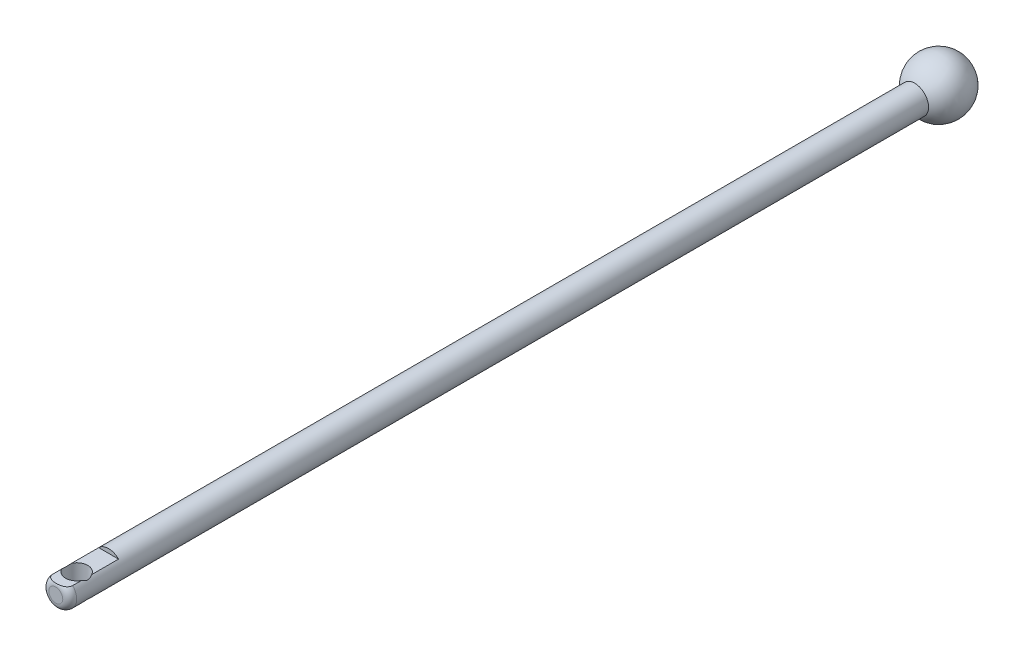
ISO-10303-21;
HEADER;
FILE_DESCRIPTION(('STEP AP214'),'2;1');
FILE_NAME('part.step','',(''),(''),'','','');
FILE_SCHEMA(('AUTOMOTIVE_DESIGN { 1 0 10303 214 1 1 1 1 }'));
ENDSEC;
DATA;
#1=APPLICATION_CONTEXT('core data for automotive mechanical design processes');
#2=APPLICATION_PROTOCOL_DEFINITION('international standard','automotive_design',2000,#1);
#3=PRODUCT_CONTEXT('',#1,'mechanical');
#4=PRODUCT('Part','Part','',(#3));
#5=PRODUCT_RELATED_PRODUCT_CATEGORY('part','',(#4));
#6=PRODUCT_DEFINITION_FORMATION('','',#4);
#7=PRODUCT_DEFINITION_CONTEXT('part definition',#1,'design');
#8=PRODUCT_DEFINITION('design','',#6,#7);
#9=PRODUCT_DEFINITION_SHAPE('','',#8);
#10=(LENGTH_UNIT() NAMED_UNIT(*) SI_UNIT(.MILLI.,.METRE.));
#11=(NAMED_UNIT(*) PLANE_ANGLE_UNIT() SI_UNIT($,.RADIAN.));
#12=(NAMED_UNIT(*) SI_UNIT($,.STERADIAN.) SOLID_ANGLE_UNIT());
#13=UNCERTAINTY_MEASURE_WITH_UNIT(LENGTH_MEASURE(1.E-05),#10,'distance_accuracy_value','');
#14=(GEOMETRIC_REPRESENTATION_CONTEXT(3) GLOBAL_UNCERTAINTY_ASSIGNED_CONTEXT((#13)) GLOBAL_UNIT_ASSIGNED_CONTEXT((#10,
#11,#12)) REPRESENTATION_CONTEXT('',''));
#15=CARTESIAN_POINT('',(0.,0.,0.));
#16=DIRECTION('',(0.,0.,1.));
#17=DIRECTION('',(1.,0.,0.));
#18=AXIS2_PLACEMENT_3D('',#15,#16,#17);
#19=CARTESIAN_POINT('',(-5.91129637087673,0.,1.5));
#20=DIRECTION('',(0.,0.,-1.));
#21=DIRECTION('',(1.,0.,0.));
#22=AXIS2_PLACEMENT_3D('',#19,#20,#21);
#23=SPHERICAL_SURFACE('',#22,2.);
#24=CARTESIAN_POINT('',(-5.91129637087673,0.,-0.5));
#25=VERTEX_POINT('',#24);
#26=VERTEX_LOOP('',#25);
#27=FACE_BOUND('',#26,.T.);
#28=ADVANCED_FACE('F40',(#27),#23,.T.);
#29=CLOSED_SHELL('',(#28));
#30=MANIFOLD_SOLID_BREP('B2',#29);
#31=CARTESIAN_POINT('',(-5.91129637087673,0.,65.));
#32=DIRECTION('',(0.,0.,-1.));
#33=DIRECTION('',(-1.,0.,0.));
#34=AXIS2_PLACEMENT_3D('',#31,#32,#33);
#35=CYLINDRICAL_SURFACE('',#34,1.);
#36=CARTESIAN_POINT('',(-5.91129637087673,-1.,62.7));
#37=CARTESIAN_POINT('',(-5.8728975524529,-0.999997095004284,62.7000029927936));
#38=CARTESIAN_POINT('',(-5.83444307764066,-0.997765483091585,62.7027877610118));
#39=CARTESIAN_POINT('',(-5.75876864077151,-0.989037067977546,62.7137399864934));
#40=CARTESIAN_POINT('',(-5.72155160144877,-0.982530829470957,62.7219193513057));
#41=CARTESIAN_POINT('',(-5.64965839987348,-0.965866889775286,62.7430713087748));
#42=CARTESIAN_POINT('',(-5.61496769046908,-0.955732481257536,62.7560133398195));
#43=CARTESIAN_POINT('',(-5.54852584255614,-0.932544043305532,62.786046938144));
#44=CARTESIAN_POINT('',(-5.51677471336037,-0.919490004622143,62.8031385185691));
#45=CARTESIAN_POINT('',(-5.44602387577503,-0.886302659197389,62.8474513457039));
#46=CARTESIAN_POINT('',(-5.40834929893991,-0.865286994497751,62.8761275659892));
#47=CARTESIAN_POINT('',(-5.33913089969394,-0.821168770326977,62.9389112263764));
#48=CARTESIAN_POINT('',(-5.30760532478215,-0.798060288744221,62.973034301414));
#49=CARTESIAN_POINT('',(-5.25043269501594,-0.751424006578055,63.0467095936162));
#50=CARTESIAN_POINT('',(-5.22488581702493,-0.727895323756975,63.0863387092217));
#51=CARTESIAN_POINT('',(-5.18070903324516,-0.683528439383609,63.1706155129706));
#52=CARTESIAN_POINT('',(-5.16205597338397,-0.662681387822585,63.2152457334182));
#53=CARTESIAN_POINT('',(-5.13895219576353,-0.635342609516173,63.2895515807352));
#54=CARTESIAN_POINT('',(-5.13183446751345,-0.626514912008718,63.3175246954005));
#55=CARTESIAN_POINT('',(-5.12060278360547,-0.612279557513362,63.3748850738562));
#56=CARTESIAN_POINT('',(-5.11648144332855,-0.606863496958356,63.4042686694743));
#57=CARTESIAN_POINT('',(-5.11153701032633,-0.600336936001032,63.464077007501));
#58=CARTESIAN_POINT('',(-5.11074298842838,-0.599264387640664,63.4945085939149));
#59=CARTESIAN_POINT('',(-5.11261844407258,-0.601759849276778,63.5550819568246));
#60=CARTESIAN_POINT('',(-5.11529085283073,-0.605331786659591,63.5852234663089));
#61=CARTESIAN_POINT('',(-5.12451516003049,-0.617282885177822,63.6488889210395));
#62=CARTESIAN_POINT('',(-5.13160913805442,-0.626327368191767,63.682203202419));
#63=CARTESIAN_POINT('',(-5.14951818148034,-0.647989839750477,63.7466142238144));
#64=CARTESIAN_POINT('',(-5.1603442683069,-0.66061839279586,63.7777040626147));
#65=CARTESIAN_POINT('',(-5.19139996209995,-0.694624464633869,63.8522648424141));
#66=CARTESIAN_POINT('',(-5.21363682449435,-0.717253491870261,63.8943210793196));
#67=CARTESIAN_POINT('',(-5.26474250088473,-0.763655120243095,63.9734866711184));
#68=CARTESIAN_POINT('',(-5.29362098326342,-0.787429348197357,64.0105886883367));
#69=CARTESIAN_POINT('',(-5.35871309757148,-0.834451007869819,64.0805099085593));
#70=CARTESIAN_POINT('',(-5.39510156677478,-0.857667557032085,64.1131887689168));
#71=CARTESIAN_POINT('',(-5.47450240657596,-0.900687485988702,64.1720397997761));
#72=CARTESIAN_POINT('',(-5.51749651276467,-0.920499967325248,64.19822940646));
#73=CARTESIAN_POINT('',(-5.59618524514263,-0.949698342546378,64.2362251389525));
#74=CARTESIAN_POINT('',(-5.63042528000959,-0.960444284811809,64.2500018017413));
#75=CARTESIAN_POINT('',(-5.70133080131203,-0.978390256529128,64.2728505804278));
#76=CARTESIAN_POINT('',(-5.73799443611735,-0.985592958297219,64.2819262421004));
#77=CARTESIAN_POINT('',(-5.81301107758527,-0.995881342428931,64.2948554186505));
#78=CARTESIAN_POINT('',(-5.85137184892024,-0.998945513369642,64.2986816494363));
#79=CARTESIAN_POINT('',(-5.92833957109042,-1.00059473197216,64.300743620052));
#80=CARTESIAN_POINT('',(-5.96694647473126,-0.999180613983052,64.2989804012511));
#81=CARTESIAN_POINT('',(-6.03999504372954,-0.992307430577586,64.2903668719188));
#82=CARTESIAN_POINT('',(-6.07452073904491,-0.987185395273574,64.2839403242609));
#83=CARTESIAN_POINT('',(-6.14183062909503,-0.973670067205679,64.2668511332457));
#84=CARTESIAN_POINT('',(-6.17461430372093,-0.965275803631163,64.2561872327247));
#85=CARTESIAN_POINT('',(-6.23979076723145,-0.945159341005589,64.2303398288159));
#86=CARTESIAN_POINT('',(-6.27203399266472,-0.933263433232208,64.214917599364));
#87=CARTESIAN_POINT('',(-6.33346019863717,-0.907134708616303,64.1804552256068));
#88=CARTESIAN_POINT('',(-6.36264302645034,-0.89290177523776,64.1614149008772));
#89=CARTESIAN_POINT('',(-6.42299809506064,-0.859973781867607,64.1163098890935));
#90=CARTESIAN_POINT('',(-6.45350238911923,-0.840943947762353,64.0895977663071));
#91=CARTESIAN_POINT('',(-6.50990796981068,-0.801777934534254,64.0322467774765));
#92=CARTESIAN_POINT('',(-6.53579563607759,-0.781638703905012,64.0015967366083));
#93=CARTESIAN_POINT('',(-6.58783120782632,-0.737358110582148,63.9297393236181));
#94=CARTESIAN_POINT('',(-6.61285615375119,-0.713279646517609,63.887674708547));
#95=CARTESIAN_POINT('',(-6.65531825666439,-0.668854105151045,63.7981049790727));
#96=CARTESIAN_POINT('',(-6.67278844042824,-0.648491016203308,63.7506247158305));
#97=CARTESIAN_POINT('',(-6.69273819037037,-0.624079615098614,63.6735572508969));
#98=CARTESIAN_POINT('',(-6.698414916122,-0.616839384317604,63.6458287646778));
#99=CARTESIAN_POINT('',(-6.70681168778454,-0.6059729702297,63.589267118758));
#100=CARTESIAN_POINT('',(-6.7095391925324,-0.602337671676747,63.5604369376508));
#101=CARTESIAN_POINT('',(-6.71182467676386,-0.599299085408279,63.5022598886424));
#102=CARTESIAN_POINT('',(-6.71136562599281,-0.599918536628492,63.4729110819695));
#103=CARTESIAN_POINT('',(-6.70728247309508,-0.605323053776439,63.4148066596987));
#104=CARTESIAN_POINT('',(-6.70365335297987,-0.610114723984132,63.3860520585894));
#105=CARTESIAN_POINT('',(-6.69212714045585,-0.624828298619334,63.3221563759204));
#106=CARTESIAN_POINT('',(-6.68333236072652,-0.635796941848969,63.2874271550824));
#107=CARTESIAN_POINT('',(-6.6617300142961,-0.66115572266818,63.2205502311615));
#108=CARTESIAN_POINT('',(-6.64891062608468,-0.67555590933516,63.1884104882342));
#109=CARTESIAN_POINT('',(-6.6130604690289,-0.713068932115472,63.1127103652632));
#110=CARTESIAN_POINT('',(-6.58803573585862,-0.737170053747153,63.0705860632571));
#111=CARTESIAN_POINT('',(-6.53094425509782,-0.785781068417763,62.9916612528112));
#112=CARTESIAN_POINT('',(-6.49886952467677,-0.810291395498804,62.9548668585079));
#113=CARTESIAN_POINT('',(-6.42732453272597,-0.857660795192059,62.8866580588827));
#114=CARTESIAN_POINT('',(-6.38776339963732,-0.88049420681677,62.8553199568377));
#115=CARTESIAN_POINT('',(-6.30185115330442,-0.921802459359651,62.7999595199196));
#116=CARTESIAN_POINT('',(-6.25552067869608,-0.940290118005008,62.7759156084016));
#117=CARTESIAN_POINT('',(-6.17329765644898,-0.965691747955595,62.7432789813668));
#118=CARTESIAN_POINT('',(-6.13893688090381,-0.974413681439089,62.7322045958167));
#119=CARTESIAN_POINT('',(-6.06838518621517,-0.988233355578056,62.7147392599545));
#120=CARTESIAN_POINT('',(-6.03219932962257,-0.993340588177127,62.7083360421232));
#121=CARTESIAN_POINT('',(-5.98164853352195,-0.997621636639225,62.7029746531797));
#122=CARTESIAN_POINT('',(-5.96761973407751,-0.998511709140098,62.7018610107711));
#123=CARTESIAN_POINT('',(-5.939495258779,-0.999701489977427,62.7003730523283));
#124=CARTESIAN_POINT('',(-5.92539956874344,-1.00000106695287,62.6999989008006));
#125=CARTESIAN_POINT('',(-5.91129637087673,-1.,62.7));
#126=B_SPLINE_CURVE_WITH_KNOTS('',3,(#36,#37,#38,#39,#40,#41,#42,#43,#44,#45,#46,#47,#48,#49,
#50,#51,#52,#53,#54,#55,#56,#57,#58,#59,#60,#61,#62,#63,#64,#65,#66,#67,#68,#69,#70,#71,#72,#73,
#74,#75,#76,#77,#78,#79,#80,#81,#82,#83,#84,#85,#86,#87,#88,#89,#90,#91,#92,#93,#94,#95,#96,#97,
#98,#99,#100,#101,#102,#103,#104,#105,#106,#107,#108,#109,#110,#111,#112,#113,#114,#115,#116,
#117,#118,#119,#120,#121,#122,#123,#124,#125),.UNSPECIFIED.,.T.,.F.,(4,2,2,2,2,2,2,2,2,2,2,2,2,
2,2,2,2,2,2,2,2,2,2,2,2,2,2,2,2,2,2,2,2,2,2,2,2,2,2,2,2,2,2,2,4),(0.,0.115134642396887,
0.230524277055737,0.345186022900243,0.459848131988321,0.614431552800397,0.769466952751399,
0.926938967061915,1.0838771717005,1.17413794531677,1.264175509528,1.35499811389826,
1.44589756801017,1.55103452002263,1.65648465387711,1.81370299264715,1.97115166344032,
2.13279269304705,2.29399457605585,2.40885591239256,2.52363048684902,2.63899937445362,
2.75434676896906,2.86034801964664,2.96638074293232,3.07897101210016,3.19156689729913,
3.32546214889077,3.45974611977678,3.62268108273938,3.78489636759473,3.87222484533902,
3.95933194141156,4.04690493045579,4.13461679287075,4.24638953288106,4.35849370485489,
4.5214712755505,4.68463434799957,4.84992227782967,5.0147163986569,5.12569840029574,
5.23638787894718,5.27866536584166,5.32095225668071),.UNSPECIFIED.);
#127=CARTESIAN_POINT('',(-5.91129637087673,-1.,62.7));
#128=VERTEX_POINT('',#127);
#129=EDGE_CURVE('E101',#128,#128,#126,.T.);
#130=ORIENTED_EDGE('',*,*,#129,.F.);
#131=EDGE_LOOP('',(#130));
#132=FACE_BOUND('',#131,.T.);
#133=CARTESIAN_POINT('',(-5.91129637087673,0.,0.5));
#134=DIRECTION('',(0.,0.,1.));
#135=DIRECTION('',(1.,0.,0.));
#136=AXIS2_PLACEMENT_3D('',#133,#134,#135);
#137=CIRCLE('',#136,1.);
#138=CARTESIAN_POINT('',(-4.91129637087673,0.,0.5));
#139=VERTEX_POINT('',#138);
#140=EDGE_CURVE('E160',#139,#139,#137,.T.);
#141=ORIENTED_EDGE('',*,*,#140,.T.);
#142=EDGE_LOOP('',(#141));
#143=FACE_BOUND('',#142,.T.);
#144=DIRECTION('',(0.,0.,-1.));
#145=VECTOR('',#144,1.);
#146=CARTESIAN_POINT('',(-5.19715352802244,0.7,65.));
#147=LINE('',#146,#145);
#148=CARTESIAN_POINT('',(-5.19715352802244,0.7,64.5));
#149=VERTEX_POINT('',#148);
#150=CARTESIAN_POINT('',(-5.19715352802244,0.7,63.8605551275464));
#151=VERTEX_POINT('',#150);
#152=EDGE_CURVE('E103',#149,#151,#147,.T.);
#153=ORIENTED_EDGE('',*,*,#152,.F.);
#154=CARTESIAN_POINT('',(-5.91129637087673,0.,64.5));
#155=DIRECTION('',(0.,0.,1.));
#156=DIRECTION('',(1.,0.,0.));
#157=AXIS2_PLACEMENT_3D('',#154,#155,#156);
#158=CIRCLE('',#157,1.);
#159=CARTESIAN_POINT('',(-6.62543921373101,0.7,64.5));
#160=VERTEX_POINT('',#159);
#161=EDGE_CURVE('E163',#149,#160,#158,.F.);
#162=ORIENTED_EDGE('',*,*,#161,.T.);
#163=DIRECTION('',(0.,0.,-1.));
#164=VECTOR('',#163,1.);
#165=CARTESIAN_POINT('',(-6.62543921373101,0.7,65.));
#166=LINE('',#165,#164);
#167=CARTESIAN_POINT('',(-6.62543921373101,0.7,63.8605551275464));
#168=VERTEX_POINT('',#167);
#169=EDGE_CURVE('E76',#168,#160,#166,.F.);
#170=ORIENTED_EDGE('',*,*,#169,.F.);
#171=CARTESIAN_POINT('',(-5.91129637087673,1.,62.7));
#172=CARTESIAN_POINT('',(-5.94969518930056,0.999997095004284,62.7000029927936));
#173=CARTESIAN_POINT('',(-5.9881496641128,0.997765483091585,62.7027877610118));
#174=CARTESIAN_POINT('',(-6.06382410098195,0.989037067977546,62.7137399864934));
#175=CARTESIAN_POINT('',(-6.10104114030469,0.982530829470957,62.7219193513057));
#176=CARTESIAN_POINT('',(-6.17293434187998,0.965866889775286,62.7430713087748));
#177=CARTESIAN_POINT('',(-6.20762505128437,0.955732481257536,62.7560133398195));
#178=CARTESIAN_POINT('',(-6.27406689919732,0.932544043305532,62.786046938144));
#179=CARTESIAN_POINT('',(-6.30581802839308,0.919490004622143,62.8031385185691));
#180=CARTESIAN_POINT('',(-6.37656886597842,0.886302659197389,62.8474513457039));
#181=CARTESIAN_POINT('',(-6.41424344281355,0.865286994497751,62.8761275659892));
#182=CARTESIAN_POINT('',(-6.48346184205952,0.821168770326977,62.9389112263764));
#183=CARTESIAN_POINT('',(-6.5149874169713,0.798060288744221,62.973034301414));
#184=CARTESIAN_POINT('',(-6.57216004673751,0.751424006578055,63.0467095936162));
#185=CARTESIAN_POINT('',(-6.59770692472853,0.727895323756975,63.0863387092217));
#186=CARTESIAN_POINT('',(-6.6418837085083,0.683528439383609,63.1706155129706));
#187=CARTESIAN_POINT('',(-6.66053676836949,0.662681387822585,63.2152457334182));
#188=CARTESIAN_POINT('',(-6.68364054598993,0.635342609516173,63.2895515807352));
#189=CARTESIAN_POINT('',(-6.69075827424001,0.626514912008718,63.3175246954005));
#190=CARTESIAN_POINT('',(-6.70198995814799,0.612279557513362,63.3748850738562));
#191=CARTESIAN_POINT('',(-6.70611129842491,0.606863496958356,63.4042686694743));
#192=CARTESIAN_POINT('',(-6.71105573142712,0.600336936001032,63.464077007501));
#193=CARTESIAN_POINT('',(-6.71184975332508,0.599264387640664,63.4945085939149));
#194=CARTESIAN_POINT('',(-6.70997429768087,0.601759849276778,63.5550819568246));
#195=CARTESIAN_POINT('',(-6.70730188892273,0.605331786659591,63.5852234663089));
#196=CARTESIAN_POINT('',(-6.69807758172297,0.617282885177822,63.6488889210395));
#197=CARTESIAN_POINT('',(-6.69098360369904,0.626327368191767,63.682203202419));
#198=CARTESIAN_POINT('',(-6.67307456027312,0.647989839750477,63.7466142238144));
#199=CARTESIAN_POINT('',(-6.66224847344655,0.66061839279586,63.7777040626147));
#200=CARTESIAN_POINT('',(-6.63119277965351,0.694624464633869,63.8522648424141));
#201=CARTESIAN_POINT('',(-6.6089559172591,0.717253491870261,63.8943210793196));
#202=CARTESIAN_POINT('',(-6.55785024086873,0.763655120243095,63.9734866711184));
#203=CARTESIAN_POINT('',(-6.52897175849004,0.787429348197357,64.0105886883367));
#204=CARTESIAN_POINT('',(-6.46387964418198,0.834451007869819,64.0805099085593));
#205=CARTESIAN_POINT('',(-6.42749117497868,0.857667557032085,64.1131887689168));
#206=CARTESIAN_POINT('',(-6.34809033517749,0.900687485988702,64.1720397997761));
#207=CARTESIAN_POINT('',(-6.30509622898879,0.920499967325248,64.19822940646));
#208=CARTESIAN_POINT('',(-6.22640749661083,0.949698342546378,64.2362251389525));
#209=CARTESIAN_POINT('',(-6.19216746174387,0.960444284811808,64.2500018017413));
#210=CARTESIAN_POINT('',(-6.12126194044142,0.978390256529128,64.2728505804278));
#211=CARTESIAN_POINT('',(-6.08459830563611,0.985592958297219,64.2819262421004));
#212=CARTESIAN_POINT('',(-6.00958166416819,0.995881342428931,64.2948554186505));
#213=CARTESIAN_POINT('',(-5.97122089283321,0.998945513369642,64.2986816494363));
#214=CARTESIAN_POINT('',(-5.89425317066304,1.00059473197216,64.300743620052));
#215=CARTESIAN_POINT('',(-5.85564626702219,0.999180613983052,64.2989804012511));
#216=CARTESIAN_POINT('',(-5.78259769802392,0.992307430577586,64.2903668719188));
#217=CARTESIAN_POINT('',(-5.74807200270855,0.987185395273574,64.2839403242609));
#218=CARTESIAN_POINT('',(-5.68076211265843,0.973670067205679,64.2668511332457));
#219=CARTESIAN_POINT('',(-5.64797843803253,0.965275803631163,64.2561872327247));
#220=CARTESIAN_POINT('',(-5.582801974522,0.945159341005589,64.2303398288159));
#221=CARTESIAN_POINT('',(-5.55055874908873,0.933263433232208,64.214917599364));
#222=CARTESIAN_POINT('',(-5.48913254311628,0.907134708616303,64.1804552256068));
#223=CARTESIAN_POINT('',(-5.45994971530311,0.89290177523776,64.1614149008772));
#224=CARTESIAN_POINT('',(-5.39959464669282,0.859973781867608,64.1163098890935));
#225=CARTESIAN_POINT('',(-5.36909035263423,0.840943947762353,64.0895977663071));
#226=CARTESIAN_POINT('',(-5.31268477194278,0.801777934534254,64.0322467774765));
#227=CARTESIAN_POINT('',(-5.28679710567587,0.781638703905012,64.0015967366083));
#228=CARTESIAN_POINT('',(-5.23476153392714,0.737358110582148,63.9297393236181));
#229=CARTESIAN_POINT('',(-5.20973658800226,0.713279646517609,63.887674708547));
#230=CARTESIAN_POINT('',(-5.16727448508907,0.668854105151045,63.7981049790727));
#231=CARTESIAN_POINT('',(-5.14980430132521,0.648491016203308,63.7506247158305));
#232=CARTESIAN_POINT('',(-5.12985455138309,0.624079615098614,63.6735572508969));
#233=CARTESIAN_POINT('',(-5.12417782563146,0.616839384317604,63.6458287646778));
#234=CARTESIAN_POINT('',(-5.11578105396891,0.6059729702297,63.589267118758));
#235=CARTESIAN_POINT('',(-5.11305354922106,0.602337671676747,63.5604369376508));
#236=CARTESIAN_POINT('',(-5.1107680649896,0.599299085408279,63.5022598886424));
#237=CARTESIAN_POINT('',(-5.11122711576065,0.599918536628492,63.4729110819695));
#238=CARTESIAN_POINT('',(-5.11531026865837,0.605323053776439,63.4148066596987));
#239=CARTESIAN_POINT('',(-5.11893938877359,0.610114723984132,63.3860520585894));
#240=CARTESIAN_POINT('',(-5.13046560129761,0.624828298619334,63.3221563759204));
#241=CARTESIAN_POINT('',(-5.13926038102693,0.635796941848969,63.2874271550824));
#242=CARTESIAN_POINT('',(-5.16086272745736,0.661155722668181,63.2205502311615));
#243=CARTESIAN_POINT('',(-5.17368211566878,0.67555590933516,63.1884104882342));
#244=CARTESIAN_POINT('',(-5.20953227272455,0.713068932115471,63.1127103652632));
#245=CARTESIAN_POINT('',(-5.23455700589484,0.737170053747153,63.0705860632571));
#246=CARTESIAN_POINT('',(-5.29164848665564,0.785781068417763,62.9916612528112));
#247=CARTESIAN_POINT('',(-5.32372321707669,0.810291395498804,62.9548668585079));
#248=CARTESIAN_POINT('',(-5.39526820902748,0.857660795192059,62.8866580588827));
#249=CARTESIAN_POINT('',(-5.43482934211614,0.88049420681677,62.8553199568377));
#250=CARTESIAN_POINT('',(-5.52074158844904,0.921802459359651,62.7999595199196));
#251=CARTESIAN_POINT('',(-5.56707206305738,0.940290118005008,62.7759156084016));
#252=CARTESIAN_POINT('',(-5.64929508530448,0.965691747955595,62.7432789813668));
#253=CARTESIAN_POINT('',(-5.68365586084965,0.974413681439089,62.7322045958167));
#254=CARTESIAN_POINT('',(-5.75420755553829,0.988233355578057,62.7147392599545));
#255=CARTESIAN_POINT('',(-5.79039341213089,0.993340588177127,62.7083360421232));
#256=CARTESIAN_POINT('',(-5.84094420823151,0.997621636639225,62.7029746531797));
#257=CARTESIAN_POINT('',(-5.85497300767595,0.998511709140098,62.7018610107711));
#258=CARTESIAN_POINT('',(-5.88309748297446,0.999701489977427,62.7003730523283));
#259=CARTESIAN_POINT('',(-5.89719317301001,1.00000106695287,62.6999989008006));
#260=CARTESIAN_POINT('',(-5.91129637087673,1.,62.7));
#261=B_SPLINE_CURVE_WITH_KNOTS('',3,(#171,#172,#173,#174,#175,#176,#177,#178,#179,#180,#181,
#182,#183,#184,#185,#186,#187,#188,#189,#190,#191,#192,#193,#194,#195,#196,#197,#198,#199,#200,
#201,#202,#203,#204,#205,#206,#207,#208,#209,#210,#211,#212,#213,#214,#215,#216,#217,#218,#219,
#220,#221,#222,#223,#224,#225,#226,#227,#228,#229,#230,#231,#232,#233,#234,#235,#236,#237,#238,
#239,#240,#241,#242,#243,#244,#245,#246,#247,#248,#249,#250,#251,#252,#253,#254,#255,#256,#257,
#258,#259,#260),.UNSPECIFIED.,.T.,.F.,(4,2,2,2,2,2,2,2,2,2,2,2,2,2,2,2,2,2,2,2,2,2,2,2,2,2,2,2,
2,2,2,2,2,2,2,2,2,2,2,2,2,2,2,2,4),(0.,0.115134642396887,0.230524277055737,0.345186022900243,
0.459848131988321,0.614431552800397,0.769466952751399,0.926938967061915,1.0838771717005,
1.17413794531677,1.264175509528,1.35499811389826,1.44589756801017,1.55103452002263,
1.65648465387711,1.81370299264715,1.97115166344032,2.13279269304705,2.29399457605585,
2.40885591239256,2.52363048684902,2.63899937445362,2.75434676896906,2.86034801964664,
2.96638074293232,3.07897101210016,3.19156689729913,3.32546214889077,3.45974611977678,
3.62268108273938,3.78489636759473,3.87222484533902,3.95933194141156,4.04690493045579,
4.13461679287075,4.24638953288106,4.35849370485489,4.5214712755505,4.68463434799957,
4.84992227782967,5.0147163986569,5.12569840029574,5.23638787894718,5.27866536584166,
5.32095225668071),.UNSPECIFIED.);
#262=CARTESIAN_POINT('',(-6.62543921373101,0.699999999999999,63.1394448724536));
#263=VERTEX_POINT('',#262);
#264=EDGE_CURVE('E110',#263,#168,#261,.T.);
#265=ORIENTED_EDGE('',*,*,#264,.F.);
#266=CARTESIAN_POINT('',(-6.62543921373101,0.7,61.2021933130812));
#267=VERTEX_POINT('',#266);
#268=EDGE_CURVE('E68',#267,#263,#166,.F.);
#269=ORIENTED_EDGE('',*,*,#268,.F.);
#270=CARTESIAN_POINT('',(-5.91129637087673,0.,61.2021933130812));
#271=DIRECTION('',(0.,0.,-1.));
#272=DIRECTION('',(-1.,0.,0.));
#273=AXIS2_PLACEMENT_3D('',#270,#271,#272);
#274=CIRCLE('',#273,1.);
#275=CARTESIAN_POINT('',(-5.19715352802244,0.7,61.2021933130812));
#276=VERTEX_POINT('',#275);
#277=EDGE_CURVE('E38',#267,#276,#274,.T.);
#278=ORIENTED_EDGE('',*,*,#277,.T.);
#279=CARTESIAN_POINT('',(-5.19715352802244,0.699999999999999,63.1394448724536));
#280=VERTEX_POINT('',#279);
#281=EDGE_CURVE('E93',#280,#276,#147,.T.);
#282=ORIENTED_EDGE('',*,*,#281,.F.);
#283=EDGE_CURVE('E123',#151,#280,#261,.T.);
#284=ORIENTED_EDGE('',*,*,#283,.F.);
#285=EDGE_LOOP('',(#153,#162,#170,#265,#269,#278,#282,#284));
#286=FACE_BOUND('',#285,.T.);
#287=ADVANCED_FACE('F52',(#132,#143,#286),#35,.T.);
#288=CARTESIAN_POINT('',(-5.91129637087673,50.,63.5));
#289=DIRECTION('',(0.,-1.,0.));
#290=DIRECTION('',(0.,0.,-1.));
#291=AXIS2_PLACEMENT_3D('',#288,#289,#290);
#292=CYLINDRICAL_SURFACE('',#291,0.799999999999996);
#293=ORIENTED_EDGE('',*,*,#129,.T.);
#294=EDGE_LOOP('',(#293));
#295=FACE_BOUND('',#294,.T.);
#296=ORIENTED_EDGE('',*,*,#283,.T.);
#297=CARTESIAN_POINT('',(-5.91129637087673,0.699999999999999,63.5));
#298=DIRECTION('',(0.,1.,0.));
#299=DIRECTION('',(0.,0.,1.));
#300=AXIS2_PLACEMENT_3D('',#297,#298,#299);
#301=CIRCLE('',#300,0.799999999999996);
#302=EDGE_CURVE('E97',#280,#263,#301,.T.);
#303=ORIENTED_EDGE('',*,*,#302,.T.);
#304=ORIENTED_EDGE('',*,*,#264,.T.);
#305=EDGE_CURVE('E112',#168,#151,#301,.T.);
#306=ORIENTED_EDGE('',*,*,#305,.T.);
#307=EDGE_LOOP('',(#296,#303,#304,#306));
#308=FACE_BOUND('',#307,.T.);
#309=ADVANCED_FACE('F130',(#295,#308),#292,.F.);
#310=CARTESIAN_POINT('',(-5.91129637087673,0.,64.5));
#311=DIRECTION('',(0.,0.,1.));
#312=DIRECTION('',(1.,0.,0.));
#313=AXIS2_PLACEMENT_3D('',#310,#311,#312);
#314=DEGENERATE_TOROIDAL_SURFACE('',#313,0.5,0.5,.T.);
#315=CARTESIAN_POINT('',(-5.91129637087673,0.,65.));
#316=DIRECTION('',(0.,0.,1.));
#317=DIRECTION('',(1.,0.,0.));
#318=AXIS2_PLACEMENT_3D('',#315,#316,#317);
#319=CIRCLE('',#318,0.5);
#320=CARTESIAN_POINT('',(-5.41129637087673,0.,65.));
#321=VERTEX_POINT('',#320);
#322=EDGE_CURVE('E165',#321,#321,#319,.T.);
#323=ORIENTED_EDGE('',*,*,#322,.F.);
#324=EDGE_LOOP('',(#323));
#325=FACE_BOUND('',#324,.T.);
#326=ORIENTED_EDGE('',*,*,#161,.F.);
#327=CARTESIAN_POINT('',(-5.91129637087673,0.7,64.9582575694956));
#328=CARTESIAN_POINT('',(-5.94221849807765,0.7,64.9582523384404));
#329=CARTESIAN_POINT('',(-5.97313969879297,0.7,64.9573737892525));
#330=CARTESIAN_POINT('',(-6.03486644204691,0.7,64.9537084999063));
#331=CARTESIAN_POINT('',(-6.06567191849782,0.7,64.9509207990026));
#332=CARTESIAN_POINT('',(-6.15742817713838,0.7,64.9391728371193));
#333=CARTESIAN_POINT('',(-6.21810828522621,0.7,64.9268356385216));
#334=CARTESIAN_POINT('',(-6.30373341535223,0.7,64.8986803420559));
#335=CARTESIAN_POINT('',(-6.33043793211705,0.7,64.8882503732304));
#336=CARTESIAN_POINT('',(-6.38225169691664,0.7,64.8638948194112));
#337=CARTESIAN_POINT('',(-6.40736061365587,0.7,64.8499685114225));
#338=CARTESIAN_POINT('',(-6.45534191726018,0.7,64.8181178081536));
#339=CARTESIAN_POINT('',(-6.47818698320707,0.7,64.8001515419945));
#340=CARTESIAN_POINT('',(-6.52013740699675,0.7,64.7602691323278));
#341=CARTESIAN_POINT('',(-6.53924908341772,0.7,64.738359785215));
#342=CARTESIAN_POINT('',(-6.56820905004374,0.7,64.6971083836748));
#343=CARTESIAN_POINT('',(-6.57917602579794,0.7,64.6785488474596));
#344=CARTESIAN_POINT('',(-6.59786444789897,0.7,64.6398555029918));
#345=CARTESIAN_POINT('',(-6.60558750640596,0.7,64.6197224826433));
#346=CARTESIAN_POINT('',(-6.61741704184966,0.7,64.5783360390961));
#347=CARTESIAN_POINT('',(-6.62151058092542,0.7,64.5570788917499));
#348=CARTESIAN_POINT('',(-6.62580666116352,0.7,64.5141729224543));
#349=CARTESIAN_POINT('',(-6.62600970722795,0.7,64.4925241516941));
#350=CARTESIAN_POINT('',(-6.62262435055978,0.7,64.4508762771757));
#351=CARTESIAN_POINT('',(-6.61926883802839,0.7,64.4308577305272));
#352=CARTESIAN_POINT('',(-6.60929228746032,0.7,64.3916586793555));
#353=CARTESIAN_POINT('',(-6.60267156162644,0.7,64.3724780949016));
#354=CARTESIAN_POINT('',(-6.58634118781241,0.7,64.3351294138025));
#355=CARTESIAN_POINT('',(-6.57658466693484,0.7,64.3169819459496));
#356=CARTESIAN_POINT('',(-6.55443043916565,0.7,64.2823842503138));
#357=CARTESIAN_POINT('',(-6.54203172960172,0.7,64.2659346703823));
#358=CARTESIAN_POINT('',(-6.51366731744444,0.7,64.2333661171814));
#359=CARTESIAN_POINT('',(-6.49746657776205,0.7,64.2174527198964));
#360=CARTESIAN_POINT('',(-6.46301398433616,0.7,64.1880576715156));
#361=CARTESIAN_POINT('',(-6.44476165764286,0.7,64.1745765830107));
#362=CARTESIAN_POINT('',(-6.39550061433678,0.7,64.1427310008785));
#363=CARTESIAN_POINT('',(-6.36331936778133,0.7,64.1261781971911));
#364=CARTESIAN_POINT('',(-6.29673768324505,0.7,64.0983346545681));
#365=CARTESIAN_POINT('',(-6.2623304537943,0.7,64.0870609759928));
#366=CARTESIAN_POINT('',(-6.19618032263029,0.7,64.0697715329038));
#367=CARTESIAN_POINT('',(-6.16454574598591,0.7,64.0633225593503));
#368=CARTESIAN_POINT('',(-6.10083770902004,0.7,64.0531365609204));
#369=CARTESIAN_POINT('',(-6.06876395701145,0.7,64.0494014373574));
#370=CARTESIAN_POINT('',(-6.00433130187091,0.7,64.0441120080967));
#371=CARTESIAN_POINT('',(-5.97197178886338,0.7,64.0425655617619));
#372=CARTESIAN_POINT('',(-5.90723662711989,0.7,64.0414195601703));
#373=CARTESIAN_POINT('',(-5.87486099490582,0.7,64.0418190173197));
#374=CARTESIAN_POINT('',(-5.81687305595352,0.7,64.0443458525399));
#375=CARTESIAN_POINT('',(-5.79124540995503,0.7,64.0460991757136));
#376=CARTESIAN_POINT('',(-5.74013353758046,0.7,64.0510561956246));
#377=CARTESIAN_POINT('',(-5.71464934804287,0.7,64.0542602491069));
#378=CARTESIAN_POINT('',(-5.63881321503973,0.7,64.0664229173859));
#379=CARTESIAN_POINT('',(-5.58878085191435,0.7,64.0779391336071));
#380=CARTESIAN_POINT('',(-5.51122962220895,0.7,64.1040996170751));
#381=CARTESIAN_POINT('',(-5.48268378048419,0.7,64.1156689792658));
#382=CARTESIAN_POINT('',(-5.42757545106513,0.7,64.1429038455845));
#383=CARTESIAN_POINT('',(-5.40101160821173,0.7,64.1585665173684));
#384=CARTESIAN_POINT('',(-5.35550479226273,0.7,64.1911337047417));
#385=CARTESIAN_POINT('',(-5.33604842161142,0.7,64.2073155145636));
#386=CARTESIAN_POINT('',(-5.30003967041984,0.7,64.2426695810332));
#387=CARTESIAN_POINT('',(-5.28348650089541,0.7,64.2618410225241));
#388=CARTESIAN_POINT('',(-5.25400549305498,0.7,64.3030761776793));
#389=CARTESIAN_POINT('',(-5.24111032809934,0.7,64.325163524582));
#390=CARTESIAN_POINT('',(-5.21997068889487,0.7,64.3714679665544));
#391=CARTESIAN_POINT('',(-5.21172200343748,0.7,64.3956831100654));
#392=CARTESIAN_POINT('',(-5.2012893886289,0.7,64.441635982667));
#393=CARTESIAN_POINT('',(-5.19839109338253,0.7,64.4632132300643));
#394=CARTESIAN_POINT('',(-5.1965570643285,0.7,64.506531728505));
#395=CARTESIAN_POINT('',(-5.19761938811632,0.7,64.5282728939384));
#396=CARTESIAN_POINT('',(-5.20343019455436,0.7,64.5696972713888));
#397=CARTESIAN_POINT('',(-5.20791599255271,0.7,64.5894181498516));
#398=CARTESIAN_POINT('',(-5.22004042760589,0.7,64.6278590877487));
#399=CARTESIAN_POINT('',(-5.22767899217595,0.7,64.646579170181));
#400=CARTESIAN_POINT('',(-5.24604928507677,0.7,64.6831464761529));
#401=CARTESIAN_POINT('',(-5.25686844245098,0.7,64.7009495147486));
#402=CARTESIAN_POINT('',(-5.28104853245372,0.7,64.7347274219727));
#403=CARTESIAN_POINT('',(-5.2944103335281,0.7,64.7507016629766));
#404=CARTESIAN_POINT('',(-5.32488413450361,0.7,64.7823952937072));
#405=CARTESIAN_POINT('',(-5.34225173559958,0.7,64.7978678568949));
#406=CARTESIAN_POINT('',(-5.37894029678529,0.7,64.8262689063708));
#407=CARTESIAN_POINT('',(-5.39826227177336,0.7,64.8391960604649));
#408=CARTESIAN_POINT('',(-5.45136585507211,0.7,64.8702305454946));
#409=CARTESIAN_POINT('',(-5.48637652346754,0.7,64.8862365453246));
#410=CARTESIAN_POINT('',(-5.55844404120249,0.7,64.9126063443616));
#411=CARTESIAN_POINT('',(-5.59550598251477,0.7,64.9229553393086));
#412=CARTESIAN_POINT('',(-5.67859725286874,0.7,64.9409944570902));
#413=CARTESIAN_POINT('',(-5.72484411310781,0.7,64.9476373301781));
#414=CARTESIAN_POINT('',(-5.81782619654052,0.7,64.9562785774977));
#415=CARTESIAN_POINT('',(-5.86456234183224,0.7,64.9582654754293));
#416=CARTESIAN_POINT('',(-5.91129637087673,0.7,64.9582575694956));
#417=B_SPLINE_CURVE_WITH_KNOTS('',3,(#327,#328,#329,#330,#331,#332,#333,#334,#335,#336,#337,
#338,#339,#340,#341,#342,#343,#344,#345,#346,#347,#348,#349,#350,#351,#352,#353,#354,#355,#356,
#357,#358,#359,#360,#361,#362,#363,#364,#365,#366,#367,#368,#369,#370,#371,#372,#373,#374,#375,
#376,#377,#378,#379,#380,#381,#382,#383,#384,#385,#386,#387,#388,#389,#390,#391,#392,#393,#394,
#395,#396,#397,#398,#399,#400,#401,#402,#403,#404,#405,#406,#407,#408,#409,#410,#411,#412,#413,
#414,#415,#416),.UNSPECIFIED.,.T.,.F.,(4,2,2,2,2,2,2,2,2,2,2,2,2,2,2,2,2,2,2,2,2,2,2,2,2,2,2,2,
2,2,2,2,2,2,2,2,2,2,2,2,2,2,2,2,4),(0.,0.0927387087223249,0.185524120813956,0.369932136593547,
0.455741204678652,0.54156803153637,0.628329123650071,0.714942079902722,0.779343172507269,
0.843712221115082,0.908309809064077,0.972899013582527,1.03350768089391,1.09411055424111,
1.15566507701983,1.21724300057759,1.28511376692459,1.35300021164938,1.46094047192247,
1.56922719169693,1.66593923123396,1.76271896171479,1.8598453461832,1.95692244176207,
2.03394257955571,2.11098166744681,2.26417368729671,2.35632396943869,2.44841065672291,
2.52403308880225,2.59963493751069,2.67589220507272,2.7520802473016,2.81704576070049,
2.88197941728577,2.94237706249352,3.00277331918547,3.06501610691871,3.12728019210245,
3.19680320775206,3.26636251360129,3.38117557238122,3.49628767326491,3.63610367189957,
3.77626393573964),.UNSPECIFIED.);
#418=EDGE_CURVE('E61',#149,#160,#417,.T.);
#419=ORIENTED_EDGE('',*,*,#418,.T.);
#420=EDGE_LOOP('',(#326,#419));
#421=FACE_BOUND('',#420,.T.);
#422=ADVANCED_FACE('F54',(#325,#421),#314,.T.);
#423=CARTESIAN_POINT('',(-5.91129637087673,0.,65.));
#424=DIRECTION('',(0.,0.,1.));
#425=DIRECTION('',(1.,0.,0.));
#426=AXIS2_PLACEMENT_3D('',#423,#424,#425);
#427=PLANE('',#426);
#428=ORIENTED_EDGE('',*,*,#322,.T.);
#429=EDGE_LOOP('',(#428));
#430=FACE_BOUND('',#429,.T.);
#431=ADVANCED_FACE('F137',(#430),#427,.T.);
#432=CARTESIAN_POINT('',(-5.91129637087673,0.,0.));
#433=DIRECTION('',(0.,0.,1.));
#434=DIRECTION('',(1.,0.,0.));
#435=AXIS2_PLACEMENT_3D('',#432,#433,#434);
#436=PLANE('',#435);
#437=CARTESIAN_POINT('',(-5.91129637087673,0.,0.));
#438=DIRECTION('',(0.,0.,1.));
#439=DIRECTION('',(1.,0.,0.));
#440=AXIS2_PLACEMENT_3D('',#437,#438,#439);
#441=CIRCLE('',#440,0.5);
#442=CARTESIAN_POINT('',(-5.41129637087673,0.,0.));
#443=VERTEX_POINT('',#442);
#444=EDGE_CURVE('E162',#443,#443,#441,.F.);
#445=ORIENTED_EDGE('',*,*,#444,.T.);
#446=EDGE_LOOP('',(#445));
#447=FACE_BOUND('',#446,.T.);
#448=ADVANCED_FACE('F140',(#447),#436,.F.);
#449=CARTESIAN_POINT('',(-5.91129637087673,0.,0.5));
#450=DIRECTION('',(0.,0.,1.));
#451=DIRECTION('',(1.,0.,0.));
#452=AXIS2_PLACEMENT_3D('',#449,#450,#451);
#453=DEGENERATE_TOROIDAL_SURFACE('',#452,0.5,0.5,.T.);
#454=ORIENTED_EDGE('',*,*,#444,.F.);
#455=EDGE_LOOP('',(#454));
#456=FACE_BOUND('',#455,.T.);
#457=ORIENTED_EDGE('',*,*,#140,.F.);
#458=EDGE_LOOP('',(#457));
#459=FACE_BOUND('',#458,.T.);
#460=ADVANCED_FACE('F143',(#456,#459),#453,.T.);
#461=CARTESIAN_POINT('',(0.,0.7,0.));
#462=DIRECTION('',(0.,1.,0.));
#463=DIRECTION('',(0.,0.,1.));
#464=AXIS2_PLACEMENT_3D('',#461,#462,#463);
#465=PLANE('',#464);
#466=ORIENTED_EDGE('',*,*,#169,.T.);
#467=ORIENTED_EDGE('',*,*,#418,.F.);
#468=ORIENTED_EDGE('',*,*,#152,.T.);
#469=ORIENTED_EDGE('',*,*,#305,.F.);
#470=EDGE_LOOP('',(#466,#467,#468,#469));
#471=FACE_BOUND('',#470,.T.);
#472=ADVANCED_FACE('F148',(#471),#465,.T.);
#473=CARTESIAN_POINT('',(-7.52337367553643,0.7,61.2021933130812));
#474=DIRECTION('',(0.,0.,-1.));
#475=DIRECTION('',(-1.,0.,0.));
#476=AXIS2_PLACEMENT_3D('',#473,#474,#475);
#477=PLANE('',#476);
#478=DIRECTION('',(-1.,0.,0.));
#479=VECTOR('',#478,1.);
#480=CARTESIAN_POINT('',(-7.52337367553643,0.7,61.2021933130812));
#481=LINE('',#480,#479);
#482=EDGE_CURVE('E96',#276,#267,#481,.T.);
#483=ORIENTED_EDGE('',*,*,#482,.F.);
#484=ORIENTED_EDGE('',*,*,#277,.F.);
#485=EDGE_LOOP('',(#483,#484));
#486=FACE_BOUND('',#485,.T.);
#487=ADVANCED_FACE('F105',(#486),#477,.F.);
#488=ORIENTED_EDGE('',*,*,#281,.T.);
#489=ORIENTED_EDGE('',*,*,#482,.T.);
#490=ORIENTED_EDGE('',*,*,#268,.T.);
#491=ORIENTED_EDGE('',*,*,#302,.F.);
#492=EDGE_LOOP('',(#488,#489,#490,#491));
#493=FACE_BOUND('',#492,.T.);
#494=ADVANCED_FACE('F95',(#493),#465,.T.);
#495=CLOSED_SHELL('',(#287,#309,#422,#431,#448,#460,#472,#487,#494));
#496=MANIFOLD_SOLID_BREP('B6',#495);
#497=ADVANCED_BREP_SHAPE_REPRESENTATION('',(#18,#30,#496),#14);
#498=SHAPE_DEFINITION_REPRESENTATION(#9,#497);
ENDSEC;
END-ISO-10303-21;
